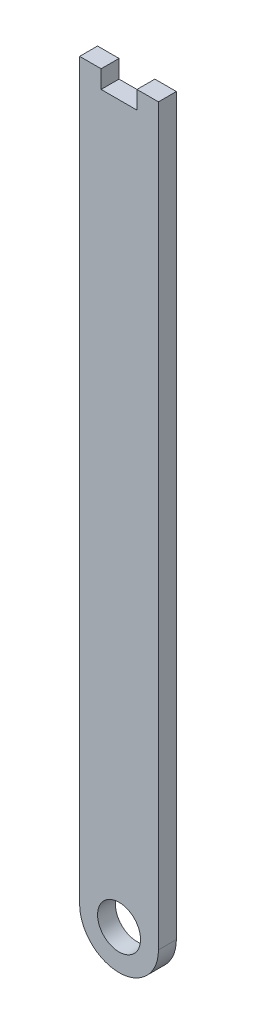
ISO-10303-21;
HEADER;
FILE_DESCRIPTION(('STEP AP214'),'2;1');
FILE_NAME('part.step','',(''),(''),'','','');
FILE_SCHEMA(('AUTOMOTIVE_DESIGN { 1 0 10303 214 1 1 1 1 }'));
ENDSEC;
DATA;
#1=APPLICATION_CONTEXT('core data for automotive mechanical design processes');
#2=APPLICATION_PROTOCOL_DEFINITION('international standard','automotive_design',2000,#1);
#3=PRODUCT_CONTEXT('',#1,'mechanical');
#4=PRODUCT('Part','Part','',(#3));
#5=PRODUCT_RELATED_PRODUCT_CATEGORY('part','',(#4));
#6=PRODUCT_DEFINITION_FORMATION('','',#4);
#7=PRODUCT_DEFINITION_CONTEXT('part definition',#1,'design');
#8=PRODUCT_DEFINITION('design','',#6,#7);
#9=PRODUCT_DEFINITION_SHAPE('','',#8);
#10=(LENGTH_UNIT() NAMED_UNIT(*) SI_UNIT(.MILLI.,.METRE.));
#11=(NAMED_UNIT(*) PLANE_ANGLE_UNIT() SI_UNIT($,.RADIAN.));
#12=(NAMED_UNIT(*) SI_UNIT($,.STERADIAN.) SOLID_ANGLE_UNIT());
#13=UNCERTAINTY_MEASURE_WITH_UNIT(LENGTH_MEASURE(1.E-05),#10,'distance_accuracy_value','');
#14=(GEOMETRIC_REPRESENTATION_CONTEXT(3) GLOBAL_UNCERTAINTY_ASSIGNED_CONTEXT((#13)) GLOBAL_UNIT_ASSIGNED_CONTEXT((#10,
#11,#12)) REPRESENTATION_CONTEXT('',''));
#15=CARTESIAN_POINT('',(0.,0.,0.));
#16=DIRECTION('',(0.,0.,1.));
#17=DIRECTION('',(1.,0.,0.));
#18=AXIS2_PLACEMENT_3D('',#15,#16,#17);
#19=CARTESIAN_POINT('',(0.,0.,2.5));
#20=DIRECTION('',(0.,0.,1.));
#21=DIRECTION('',(1.,0.,0.));
#22=AXIS2_PLACEMENT_3D('',#19,#20,#21);
#23=PLANE('',#22);
#24=CARTESIAN_POINT('',(0.,0.,2.5));
#25=DIRECTION('',(0.,0.,1.));
#26=DIRECTION('',(1.,0.,0.));
#27=AXIS2_PLACEMENT_3D('',#24,#25,#26);
#28=CIRCLE('',#27,11.);
#29=CARTESIAN_POINT('',(-11.,0.,2.5));
#30=VERTEX_POINT('',#29);
#31=CARTESIAN_POINT('',(11.,0.,2.5));
#32=VERTEX_POINT('',#31);
#33=EDGE_CURVE('E151',#30,#32,#28,.T.);
#34=ORIENTED_EDGE('',*,*,#33,.T.);
#35=DIRECTION('',(0.,1.,0.));
#36=VECTOR('',#35,1.);
#37=CARTESIAN_POINT('',(11.,0.,2.5));
#38=LINE('',#37,#36);
#39=CARTESIAN_POINT('',(11.,205.,2.5));
#40=VERTEX_POINT('',#39);
#41=EDGE_CURVE('E99',#32,#40,#38,.T.);
#42=ORIENTED_EDGE('',*,*,#41,.T.);
#43=DIRECTION('',(-1.,0.,0.));
#44=VECTOR('',#43,1.);
#45=CARTESIAN_POINT('',(4.99999999999998,205.,2.5));
#46=LINE('',#45,#44);
#47=CARTESIAN_POINT('',(4.99999999999998,205.,2.5));
#48=VERTEX_POINT('',#47);
#49=EDGE_CURVE('E166',#40,#48,#46,.T.);
#50=ORIENTED_EDGE('',*,*,#49,.T.);
#51=DIRECTION('',(0.,-1.,0.));
#52=VECTOR('',#51,1.);
#53=CARTESIAN_POINT('',(5.00000000000002,200.,2.5));
#54=LINE('',#53,#52);
#55=CARTESIAN_POINT('',(5.00000000000002,200.,2.5));
#56=VERTEX_POINT('',#55);
#57=EDGE_CURVE('E179',#48,#56,#54,.T.);
#58=ORIENTED_EDGE('',*,*,#57,.T.);
#59=DIRECTION('',(-1.,0.,0.));
#60=VECTOR('',#59,1.);
#61=CARTESIAN_POINT('',(5.00000000000002,200.,2.5));
#62=LINE('',#61,#60);
#63=CARTESIAN_POINT('',(-4.99999999999998,200.,2.5));
#64=VERTEX_POINT('',#63);
#65=EDGE_CURVE('E118',#56,#64,#62,.T.);
#66=ORIENTED_EDGE('',*,*,#65,.T.);
#67=DIRECTION('',(0.,1.,0.));
#68=VECTOR('',#67,1.);
#69=CARTESIAN_POINT('',(-4.99999999999998,200.,2.5));
#70=LINE('',#69,#68);
#71=CARTESIAN_POINT('',(-4.99999999999998,205.,2.5));
#72=VERTEX_POINT('',#71);
#73=EDGE_CURVE('E112',#64,#72,#70,.T.);
#74=ORIENTED_EDGE('',*,*,#73,.T.);
#75=DIRECTION('',(-1.,0.,0.));
#76=VECTOR('',#75,1.);
#77=CARTESIAN_POINT('',(-11.,205.,2.5));
#78=LINE('',#77,#76);
#79=CARTESIAN_POINT('',(-11.,205.,2.5));
#80=VERTEX_POINT('',#79);
#81=EDGE_CURVE('E116',#72,#80,#78,.T.);
#82=ORIENTED_EDGE('',*,*,#81,.T.);
#83=DIRECTION('',(0.,-1.,0.));
#84=VECTOR('',#83,1.);
#85=CARTESIAN_POINT('',(-11.,0.,2.5));
#86=LINE('',#85,#84);
#87=EDGE_CURVE('E56',#80,#30,#86,.T.);
#88=ORIENTED_EDGE('',*,*,#87,.T.);
#89=EDGE_LOOP('',(#34,#42,#50,#58,#66,#74,#82,#88));
#90=FACE_BOUND('',#89,.T.);
#91=CARTESIAN_POINT('',(0.,0.,2.5));
#92=DIRECTION('',(0.,0.,1.));
#93=DIRECTION('',(1.,0.,0.));
#94=AXIS2_PLACEMENT_3D('',#91,#92,#93);
#95=CIRCLE('',#94,6.);
#96=CARTESIAN_POINT('',(6.,0.,2.5));
#97=VERTEX_POINT('',#96);
#98=EDGE_CURVE('E140',#97,#97,#95,.T.);
#99=ORIENTED_EDGE('',*,*,#98,.F.);
#100=EDGE_LOOP('',(#99));
#101=FACE_BOUND('',#100,.T.);
#102=ADVANCED_FACE('F39',(#90,#101),#23,.T.);
#103=CARTESIAN_POINT('',(0.,0.,-2.5));
#104=DIRECTION('',(0.,0.,1.));
#105=DIRECTION('',(1.,0.,0.));
#106=AXIS2_PLACEMENT_3D('',#103,#104,#105);
#107=PLANE('',#106);
#108=CARTESIAN_POINT('',(0.,0.,-2.5));
#109=DIRECTION('',(0.,0.,1.));
#110=DIRECTION('',(1.,0.,0.));
#111=AXIS2_PLACEMENT_3D('',#108,#109,#110);
#112=CIRCLE('',#111,11.);
#113=CARTESIAN_POINT('',(-11.,0.,-2.5));
#114=VERTEX_POINT('',#113);
#115=CARTESIAN_POINT('',(11.,0.,-2.5));
#116=VERTEX_POINT('',#115);
#117=EDGE_CURVE('E136',#114,#116,#112,.T.);
#118=ORIENTED_EDGE('',*,*,#117,.F.);
#119=DIRECTION('',(0.,-1.,0.));
#120=VECTOR('',#119,1.);
#121=CARTESIAN_POINT('',(-11.,0.,-2.5));
#122=LINE('',#121,#120);
#123=CARTESIAN_POINT('',(-11.,205.,-2.5));
#124=VERTEX_POINT('',#123);
#125=EDGE_CURVE('E91',#124,#114,#122,.T.);
#126=ORIENTED_EDGE('',*,*,#125,.F.);
#127=DIRECTION('',(-1.,0.,0.));
#128=VECTOR('',#127,1.);
#129=CARTESIAN_POINT('',(-11.,205.,-2.5));
#130=LINE('',#129,#128);
#131=CARTESIAN_POINT('',(-4.99999999999998,205.,-2.5));
#132=VERTEX_POINT('',#131);
#133=EDGE_CURVE('E85',#132,#124,#130,.T.);
#134=ORIENTED_EDGE('',*,*,#133,.F.);
#135=DIRECTION('',(0.,1.,0.));
#136=VECTOR('',#135,1.);
#137=CARTESIAN_POINT('',(-4.99999999999998,200.,-2.5));
#138=LINE('',#137,#136);
#139=CARTESIAN_POINT('',(-4.99999999999998,200.,-2.5));
#140=VERTEX_POINT('',#139);
#141=EDGE_CURVE('E126',#140,#132,#138,.T.);
#142=ORIENTED_EDGE('',*,*,#141,.F.);
#143=DIRECTION('',(-1.,0.,0.));
#144=VECTOR('',#143,1.);
#145=CARTESIAN_POINT('',(5.00000000000002,200.,-2.5));
#146=LINE('',#145,#144);
#147=CARTESIAN_POINT('',(5.00000000000002,200.,-2.5));
#148=VERTEX_POINT('',#147);
#149=EDGE_CURVE('E146',#148,#140,#146,.T.);
#150=ORIENTED_EDGE('',*,*,#149,.F.);
#151=DIRECTION('',(0.,-1.,0.));
#152=VECTOR('',#151,1.);
#153=CARTESIAN_POINT('',(5.00000000000002,200.,-2.5));
#154=LINE('',#153,#152);
#155=CARTESIAN_POINT('',(4.99999999999998,205.,-2.5));
#156=VERTEX_POINT('',#155);
#157=EDGE_CURVE('E144',#156,#148,#154,.T.);
#158=ORIENTED_EDGE('',*,*,#157,.F.);
#159=DIRECTION('',(-1.,0.,0.));
#160=VECTOR('',#159,1.);
#161=CARTESIAN_POINT('',(4.99999999999998,205.,-2.5));
#162=LINE('',#161,#160);
#163=CARTESIAN_POINT('',(11.,205.,-2.5));
#164=VERTEX_POINT('',#163);
#165=EDGE_CURVE('E142',#164,#156,#162,.T.);
#166=ORIENTED_EDGE('',*,*,#165,.F.);
#167=DIRECTION('',(0.,1.,0.));
#168=VECTOR('',#167,1.);
#169=CARTESIAN_POINT('',(11.,0.,-2.5));
#170=LINE('',#169,#168);
#171=EDGE_CURVE('E139',#116,#164,#170,.T.);
#172=ORIENTED_EDGE('',*,*,#171,.F.);
#173=EDGE_LOOP('',(#118,#126,#134,#142,#150,#158,#166,#172));
#174=FACE_BOUND('',#173,.T.);
#175=CARTESIAN_POINT('',(0.,0.,-2.5));
#176=DIRECTION('',(0.,0.,1.));
#177=DIRECTION('',(1.,0.,0.));
#178=AXIS2_PLACEMENT_3D('',#175,#176,#177);
#179=CIRCLE('',#178,6.);
#180=CARTESIAN_POINT('',(6.,0.,-2.5));
#181=VERTEX_POINT('',#180);
#182=EDGE_CURVE('E185',#181,#181,#179,.T.);
#183=ORIENTED_EDGE('',*,*,#182,.T.);
#184=EDGE_LOOP('',(#183));
#185=FACE_BOUND('',#184,.T.);
#186=ADVANCED_FACE('F170',(#174,#185),#107,.F.);
#187=CARTESIAN_POINT('',(0.,0.,2.5));
#188=DIRECTION('',(0.,0.,-1.));
#189=DIRECTION('',(-1.,0.,0.));
#190=AXIS2_PLACEMENT_3D('',#187,#188,#189);
#191=CYLINDRICAL_SURFACE('',#190,11.);
#192=ORIENTED_EDGE('',*,*,#117,.T.);
#193=DIRECTION('',(0.,0.,-1.));
#194=VECTOR('',#193,1.);
#195=CARTESIAN_POINT('',(11.,0.,2.5));
#196=LINE('',#195,#194);
#197=EDGE_CURVE('E11',#32,#116,#196,.T.);
#198=ORIENTED_EDGE('',*,*,#197,.F.);
#199=ORIENTED_EDGE('',*,*,#33,.F.);
#200=DIRECTION('',(0.,0.,-1.));
#201=VECTOR('',#200,1.);
#202=CARTESIAN_POINT('',(-11.,0.,2.5));
#203=LINE('',#202,#201);
#204=EDGE_CURVE('E132',#30,#114,#203,.T.);
#205=ORIENTED_EDGE('',*,*,#204,.T.);
#206=EDGE_LOOP('',(#192,#198,#199,#205));
#207=FACE_BOUND('',#206,.T.);
#208=ADVANCED_FACE('F41',(#207),#191,.T.);
#209=CARTESIAN_POINT('',(11.,0.,2.5));
#210=DIRECTION('',(-1.,0.,0.));
#211=DIRECTION('',(0.,0.,1.));
#212=AXIS2_PLACEMENT_3D('',#209,#210,#211);
#213=PLANE('',#212);
#214=ORIENTED_EDGE('',*,*,#171,.T.);
#215=DIRECTION('',(0.,0.,-1.));
#216=VECTOR('',#215,1.);
#217=CARTESIAN_POINT('',(11.,205.,2.5));
#218=LINE('',#217,#216);
#219=EDGE_CURVE('E48',#40,#164,#218,.T.);
#220=ORIENTED_EDGE('',*,*,#219,.F.);
#221=ORIENTED_EDGE('',*,*,#41,.F.);
#222=ORIENTED_EDGE('',*,*,#197,.T.);
#223=EDGE_LOOP('',(#214,#220,#221,#222));
#224=FACE_BOUND('',#223,.T.);
#225=ADVANCED_FACE('F213',(#224),#213,.F.);
#226=CARTESIAN_POINT('',(4.99999999999998,205.,2.5));
#227=DIRECTION('',(0.,-1.,0.));
#228=DIRECTION('',(0.,0.,-1.));
#229=AXIS2_PLACEMENT_3D('',#226,#227,#228);
#230=PLANE('',#229);
#231=ORIENTED_EDGE('',*,*,#165,.T.);
#232=DIRECTION('',(0.,0.,-1.));
#233=VECTOR('',#232,1.);
#234=CARTESIAN_POINT('',(4.99999999999998,205.,2.5));
#235=LINE('',#234,#233);
#236=EDGE_CURVE('E158',#48,#156,#235,.T.);
#237=ORIENTED_EDGE('',*,*,#236,.F.);
#238=ORIENTED_EDGE('',*,*,#49,.F.);
#239=ORIENTED_EDGE('',*,*,#219,.T.);
#240=EDGE_LOOP('',(#231,#237,#238,#239));
#241=FACE_BOUND('',#240,.T.);
#242=ADVANCED_FACE('F164',(#241),#230,.F.);
#243=CARTESIAN_POINT('',(5.00000000000002,200.,2.5));
#244=DIRECTION('',(1.,0.,0.));
#245=DIRECTION('',(0.,1.,0.));
#246=AXIS2_PLACEMENT_3D('',#243,#244,#245);
#247=PLANE('',#246);
#248=ORIENTED_EDGE('',*,*,#157,.T.);
#249=DIRECTION('',(0.,0.,-1.));
#250=VECTOR('',#249,1.);
#251=CARTESIAN_POINT('',(5.00000000000002,200.,2.5));
#252=LINE('',#251,#250);
#253=EDGE_CURVE('E155',#56,#148,#252,.T.);
#254=ORIENTED_EDGE('',*,*,#253,.F.);
#255=ORIENTED_EDGE('',*,*,#57,.F.);
#256=ORIENTED_EDGE('',*,*,#236,.T.);
#257=EDGE_LOOP('',(#248,#254,#255,#256));
#258=FACE_BOUND('',#257,.T.);
#259=ADVANCED_FACE('F175',(#258),#247,.F.);
#260=CARTESIAN_POINT('',(5.00000000000002,200.,2.5));
#261=DIRECTION('',(0.,-1.,0.));
#262=DIRECTION('',(0.,0.,-1.));
#263=AXIS2_PLACEMENT_3D('',#260,#261,#262);
#264=PLANE('',#263);
#265=ORIENTED_EDGE('',*,*,#149,.T.);
#266=DIRECTION('',(0.,0.,-1.));
#267=VECTOR('',#266,1.);
#268=CARTESIAN_POINT('',(-4.99999999999998,200.,2.5));
#269=LINE('',#268,#267);
#270=EDGE_CURVE('E127',#64,#140,#269,.T.);
#271=ORIENTED_EDGE('',*,*,#270,.F.);
#272=ORIENTED_EDGE('',*,*,#65,.F.);
#273=ORIENTED_EDGE('',*,*,#253,.T.);
#274=EDGE_LOOP('',(#265,#271,#272,#273));
#275=FACE_BOUND('',#274,.T.);
#276=ADVANCED_FACE('F178',(#275),#264,.F.);
#277=CARTESIAN_POINT('',(-4.99999999999998,200.,2.5));
#278=DIRECTION('',(-1.,0.,0.));
#279=DIRECTION('',(0.,0.,1.));
#280=AXIS2_PLACEMENT_3D('',#277,#278,#279);
#281=PLANE('',#280);
#282=ORIENTED_EDGE('',*,*,#141,.T.);
#283=DIRECTION('',(0.,0.,-1.));
#284=VECTOR('',#283,1.);
#285=CARTESIAN_POINT('',(-4.99999999999998,205.,2.5));
#286=LINE('',#285,#284);
#287=EDGE_CURVE('E123',#72,#132,#286,.T.);
#288=ORIENTED_EDGE('',*,*,#287,.F.);
#289=ORIENTED_EDGE('',*,*,#73,.F.);
#290=ORIENTED_EDGE('',*,*,#270,.T.);
#291=EDGE_LOOP('',(#282,#288,#289,#290));
#292=FACE_BOUND('',#291,.T.);
#293=ADVANCED_FACE('F124',(#292),#281,.F.);
#294=CARTESIAN_POINT('',(-11.,205.,2.5));
#295=DIRECTION('',(0.,-1.,0.));
#296=DIRECTION('',(0.,0.,-1.));
#297=AXIS2_PLACEMENT_3D('',#294,#295,#296);
#298=PLANE('',#297);
#299=ORIENTED_EDGE('',*,*,#133,.T.);
#300=DIRECTION('',(0.,0.,-1.));
#301=VECTOR('',#300,1.);
#302=CARTESIAN_POINT('',(-11.,205.,2.5));
#303=LINE('',#302,#301);
#304=EDGE_CURVE('E128',#80,#124,#303,.T.);
#305=ORIENTED_EDGE('',*,*,#304,.F.);
#306=ORIENTED_EDGE('',*,*,#81,.F.);
#307=ORIENTED_EDGE('',*,*,#287,.T.);
#308=EDGE_LOOP('',(#299,#305,#306,#307));
#309=FACE_BOUND('',#308,.T.);
#310=ADVANCED_FACE('F130',(#309),#298,.F.);
#311=CARTESIAN_POINT('',(-11.,0.,2.5));
#312=DIRECTION('',(1.,0.,0.));
#313=DIRECTION('',(0.,0.,-1.));
#314=AXIS2_PLACEMENT_3D('',#311,#312,#313);
#315=PLANE('',#314);
#316=ORIENTED_EDGE('',*,*,#125,.T.);
#317=ORIENTED_EDGE('',*,*,#204,.F.);
#318=ORIENTED_EDGE('',*,*,#87,.F.);
#319=ORIENTED_EDGE('',*,*,#304,.T.);
#320=EDGE_LOOP('',(#316,#317,#318,#319));
#321=FACE_BOUND('',#320,.T.);
#322=ADVANCED_FACE('F201',(#321),#315,.F.);
#323=CARTESIAN_POINT('',(0.,0.,2.5));
#324=DIRECTION('',(0.,0.,-1.));
#325=DIRECTION('',(-1.,0.,0.));
#326=AXIS2_PLACEMENT_3D('',#323,#324,#325);
#327=CYLINDRICAL_SURFACE('',#326,6.);
#328=ORIENTED_EDGE('',*,*,#98,.T.);
#329=EDGE_LOOP('',(#328));
#330=FACE_BOUND('',#329,.T.);
#331=ORIENTED_EDGE('',*,*,#182,.F.);
#332=EDGE_LOOP('',(#331));
#333=FACE_BOUND('',#332,.T.);
#334=ADVANCED_FACE('F191',(#330,#333),#327,.F.);
#335=CLOSED_SHELL('',(#102,#186,#208,#225,#242,#259,#276,#293,#310,#322,#334));
#336=MANIFOLD_SOLID_BREP('B2',#335);
#337=ADVANCED_BREP_SHAPE_REPRESENTATION('',(#18,#336),#14);
#338=SHAPE_DEFINITION_REPRESENTATION(#9,#337);
ENDSEC;
END-ISO-10303-21;
